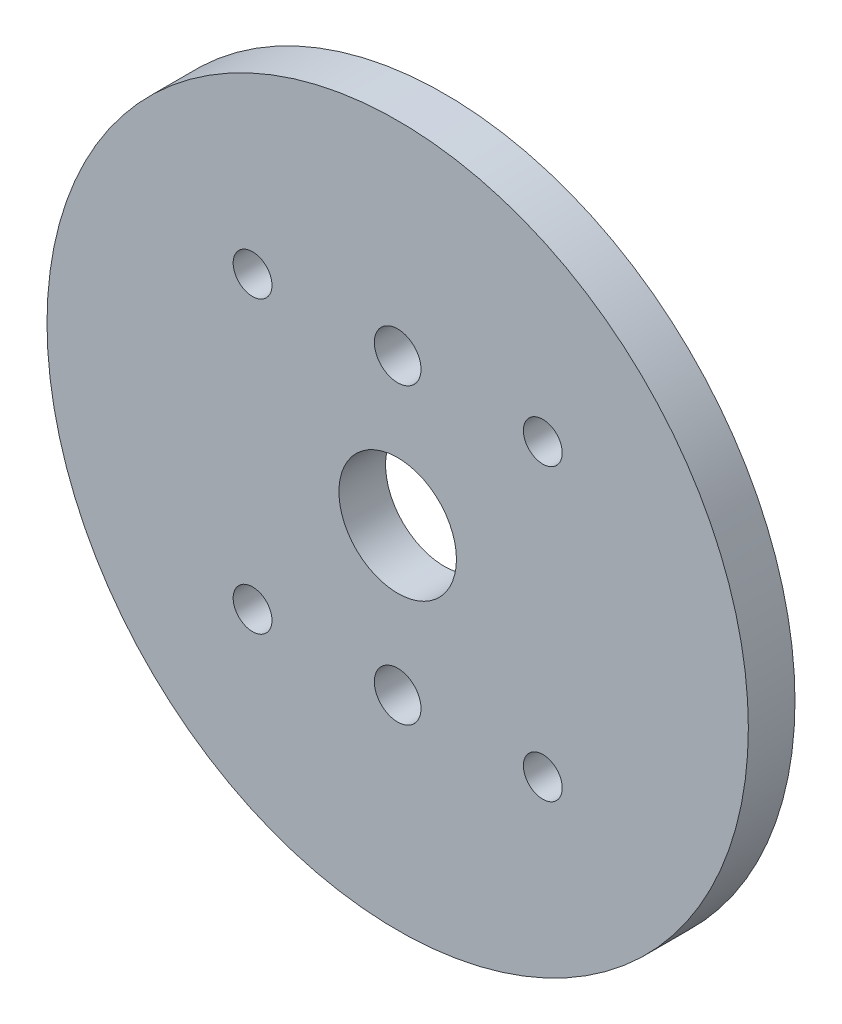
ISO-10303-21;
HEADER;
FILE_DESCRIPTION(('STEP AP214'),'2;1');
FILE_NAME('part.step','',(''),(''),'','','');
FILE_SCHEMA(('AUTOMOTIVE_DESIGN { 1 0 10303 214 1 1 1 1 }'));
ENDSEC;
DATA;
#1=APPLICATION_CONTEXT('core data for automotive mechanical design processes');
#2=APPLICATION_PROTOCOL_DEFINITION('international standard','automotive_design',2000,#1);
#3=PRODUCT_CONTEXT('',#1,'mechanical');
#4=PRODUCT('Part','Part','',(#3));
#5=PRODUCT_RELATED_PRODUCT_CATEGORY('part','',(#4));
#6=PRODUCT_DEFINITION_FORMATION('','',#4);
#7=PRODUCT_DEFINITION_CONTEXT('part definition',#1,'design');
#8=PRODUCT_DEFINITION('design','',#6,#7);
#9=PRODUCT_DEFINITION_SHAPE('','',#8);
#10=(LENGTH_UNIT() NAMED_UNIT(*) SI_UNIT(.MILLI.,.METRE.));
#11=(NAMED_UNIT(*) PLANE_ANGLE_UNIT() SI_UNIT($,.RADIAN.));
#12=(NAMED_UNIT(*) SI_UNIT($,.STERADIAN.) SOLID_ANGLE_UNIT());
#13=UNCERTAINTY_MEASURE_WITH_UNIT(LENGTH_MEASURE(1.E-05),#10,'distance_accuracy_value','');
#14=(GEOMETRIC_REPRESENTATION_CONTEXT(3) GLOBAL_UNCERTAINTY_ASSIGNED_CONTEXT((#13)) GLOBAL_UNIT_ASSIGNED_CONTEXT((#10,
#11,#12)) REPRESENTATION_CONTEXT('',''));
#15=CARTESIAN_POINT('',(0.,0.,0.));
#16=DIRECTION('',(0.,0.,1.));
#17=DIRECTION('',(1.,0.,0.));
#18=AXIS2_PLACEMENT_3D('',#15,#16,#17);
#19=CARTESIAN_POINT('',(0.,0.,3.175));
#20=DIRECTION('',(0.,0.,1.));
#21=DIRECTION('',(1.,0.,0.));
#22=AXIS2_PLACEMENT_3D('',#19,#20,#21);
#23=PLANE('',#22);
#24=CARTESIAN_POINT('',(-9.87828173317578,9.87828173317581,3.175));
#25=DIRECTION('',(0.,0.,1.));
#26=DIRECTION('',(1.,0.,0.));
#27=AXIS2_PLACEMENT_3D('',#24,#25,#26);
#28=CIRCLE('',#27,1.32080000000039);
#29=CARTESIAN_POINT('',(-8.55748173317538,9.87828173317581,3.175));
#30=VERTEX_POINT('',#29);
#31=EDGE_CURVE('E71',#30,#30,#28,.T.);
#32=ORIENTED_EDGE('',*,*,#31,.F.);
#33=EDGE_LOOP('',(#32));
#34=FACE_BOUND('',#33,.T.);
#35=CARTESIAN_POINT('',(9.87828173317605,-9.87828173317609,3.175));
#36=DIRECTION('',(0.,0.,1.));
#37=DIRECTION('',(1.,0.,0.));
#38=AXIS2_PLACEMENT_3D('',#35,#36,#37);
#39=CIRCLE('',#38,1.3208);
#40=CARTESIAN_POINT('',(11.1990817331761,-9.87828173317609,3.175));
#41=VERTEX_POINT('',#40);
#42=EDGE_CURVE('E59',#41,#41,#39,.T.);
#43=ORIENTED_EDGE('',*,*,#42,.F.);
#44=EDGE_LOOP('',(#43));
#45=FACE_BOUND('',#44,.T.);
#46=CARTESIAN_POINT('',(0.,0.,3.175));
#47=DIRECTION('',(0.,0.,1.));
#48=DIRECTION('',(1.,0.,0.));
#49=AXIS2_PLACEMENT_3D('',#46,#47,#48);
#50=CIRCLE('',#49,4.);
#51=CARTESIAN_POINT('',(4.,0.,3.175));
#52=VERTEX_POINT('',#51);
#53=EDGE_CURVE('E47',#52,#52,#50,.T.);
#54=ORIENTED_EDGE('',*,*,#53,.F.);
#55=EDGE_LOOP('',(#54));
#56=FACE_BOUND('',#55,.T.);
#57=CARTESIAN_POINT('',(0.,0.,3.175));
#58=DIRECTION('',(0.,0.,1.));
#59=DIRECTION('',(1.,0.,0.));
#60=AXIS2_PLACEMENT_3D('',#57,#58,#59);
#61=CIRCLE('',#60,23.87);
#62=CARTESIAN_POINT('',(23.87,0.,3.175));
#63=VERTEX_POINT('',#62);
#64=EDGE_CURVE('E10',#63,#63,#61,.T.);
#65=ORIENTED_EDGE('',*,*,#64,.T.);
#66=EDGE_LOOP('',(#65));
#67=FACE_BOUND('',#66,.T.);
#68=CARTESIAN_POINT('',(0.,10.,3.175));
#69=DIRECTION('',(0.,0.,1.));
#70=DIRECTION('',(1.,0.,0.));
#71=AXIS2_PLACEMENT_3D('',#68,#69,#70);
#72=CIRCLE('',#71,1.5875);
#73=CARTESIAN_POINT('',(1.5875,10.,3.175));
#74=VERTEX_POINT('',#73);
#75=EDGE_CURVE('E42',#74,#74,#72,.T.);
#76=ORIENTED_EDGE('',*,*,#75,.F.);
#77=EDGE_LOOP('',(#76));
#78=FACE_BOUND('',#77,.T.);
#79=CARTESIAN_POINT('',(9.87828173317609,9.87828173317578,3.175));
#80=DIRECTION('',(0.,0.,1.));
#81=DIRECTION('',(1.,0.,0.));
#82=AXIS2_PLACEMENT_3D('',#79,#80,#81);
#83=CIRCLE('',#82,1.32080000000006);
#84=CARTESIAN_POINT('',(11.1990817331761,9.87828173317578,3.175));
#85=VERTEX_POINT('',#84);
#86=EDGE_CURVE('E53',#85,#85,#83,.T.);
#87=ORIENTED_EDGE('',*,*,#86,.F.);
#88=EDGE_LOOP('',(#87));
#89=FACE_BOUND('',#88,.T.);
#90=CARTESIAN_POINT('',(-9.87828173317581,-9.87828173317605,3.175));
#91=DIRECTION('',(0.,0.,1.));
#92=DIRECTION('',(1.,0.,0.));
#93=AXIS2_PLACEMENT_3D('',#90,#91,#92);
#94=CIRCLE('',#93,1.32080000000029);
#95=CARTESIAN_POINT('',(-8.55748173317552,-9.87828173317605,3.175));
#96=VERTEX_POINT('',#95);
#97=EDGE_CURVE('E65',#96,#96,#94,.T.);
#98=ORIENTED_EDGE('',*,*,#97,.F.);
#99=EDGE_LOOP('',(#98));
#100=FACE_BOUND('',#99,.T.);
#101=CARTESIAN_POINT('',(2.8176792204172E-13,-10.,3.175));
#102=DIRECTION('',(0.,0.,1.));
#103=DIRECTION('',(1.,0.,0.));
#104=AXIS2_PLACEMENT_3D('',#101,#102,#103);
#105=CIRCLE('',#104,1.5875);
#106=CARTESIAN_POINT('',(1.58750000000028,-10.,3.175));
#107=VERTEX_POINT('',#106);
#108=EDGE_CURVE('E77',#107,#107,#105,.T.);
#109=ORIENTED_EDGE('',*,*,#108,.F.);
#110=EDGE_LOOP('',(#109));
#111=FACE_BOUND('',#110,.T.);
#112=ADVANCED_FACE('F31',(#34,#45,#56,#67,#78,#89,#100,#111),#23,.T.);
#113=CARTESIAN_POINT('',(0.,0.,0.));
#114=DIRECTION('',(0.,0.,1.));
#115=DIRECTION('',(1.,0.,0.));
#116=AXIS2_PLACEMENT_3D('',#113,#114,#115);
#117=PLANE('',#116);
#118=CARTESIAN_POINT('',(-9.87828173317578,9.87828173317581,0.));
#119=DIRECTION('',(0.,0.,1.));
#120=DIRECTION('',(1.,0.,0.));
#121=AXIS2_PLACEMENT_3D('',#118,#119,#120);
#122=CIRCLE('',#121,1.32080000000039);
#123=CARTESIAN_POINT('',(-8.55748173317538,9.87828173317581,0.));
#124=VERTEX_POINT('',#123);
#125=EDGE_CURVE('E74',#124,#124,#122,.T.);
#126=ORIENTED_EDGE('',*,*,#125,.T.);
#127=EDGE_LOOP('',(#126));
#128=FACE_BOUND('',#127,.T.);
#129=CARTESIAN_POINT('',(9.87828173317605,-9.87828173317609,0.));
#130=DIRECTION('',(0.,0.,1.));
#131=DIRECTION('',(1.,0.,0.));
#132=AXIS2_PLACEMENT_3D('',#129,#130,#131);
#133=CIRCLE('',#132,1.3208);
#134=CARTESIAN_POINT('',(11.1990817331761,-9.87828173317609,0.));
#135=VERTEX_POINT('',#134);
#136=EDGE_CURVE('E62',#135,#135,#133,.T.);
#137=ORIENTED_EDGE('',*,*,#136,.T.);
#138=EDGE_LOOP('',(#137));
#139=FACE_BOUND('',#138,.T.);
#140=CARTESIAN_POINT('',(0.,0.,0.));
#141=DIRECTION('',(0.,0.,1.));
#142=DIRECTION('',(1.,0.,0.));
#143=AXIS2_PLACEMENT_3D('',#140,#141,#142);
#144=CIRCLE('',#143,4.);
#145=CARTESIAN_POINT('',(4.,0.,0.));
#146=VERTEX_POINT('',#145);
#147=EDGE_CURVE('E50',#146,#146,#144,.T.);
#148=ORIENTED_EDGE('',*,*,#147,.T.);
#149=EDGE_LOOP('',(#148));
#150=FACE_BOUND('',#149,.T.);
#151=CARTESIAN_POINT('',(0.,0.,0.));
#152=DIRECTION('',(0.,0.,1.));
#153=DIRECTION('',(1.,0.,0.));
#154=AXIS2_PLACEMENT_3D('',#151,#152,#153);
#155=CIRCLE('',#154,23.87);
#156=CARTESIAN_POINT('',(23.87,0.,0.));
#157=VERTEX_POINT('',#156);
#158=EDGE_CURVE('E35',#157,#157,#155,.T.);
#159=ORIENTED_EDGE('',*,*,#158,.F.);
#160=EDGE_LOOP('',(#159));
#161=FACE_BOUND('',#160,.T.);
#162=CARTESIAN_POINT('',(0.,10.,0.));
#163=DIRECTION('',(0.,0.,1.));
#164=DIRECTION('',(1.,0.,0.));
#165=AXIS2_PLACEMENT_3D('',#162,#163,#164);
#166=CIRCLE('',#165,1.5875);
#167=CARTESIAN_POINT('',(1.5875,10.,0.));
#168=VERTEX_POINT('',#167);
#169=EDGE_CURVE('E44',#168,#168,#166,.T.);
#170=ORIENTED_EDGE('',*,*,#169,.T.);
#171=EDGE_LOOP('',(#170));
#172=FACE_BOUND('',#171,.T.);
#173=CARTESIAN_POINT('',(9.87828173317609,9.87828173317578,0.));
#174=DIRECTION('',(0.,0.,1.));
#175=DIRECTION('',(1.,0.,0.));
#176=AXIS2_PLACEMENT_3D('',#173,#174,#175);
#177=CIRCLE('',#176,1.32080000000006);
#178=CARTESIAN_POINT('',(11.1990817331761,9.87828173317578,0.));
#179=VERTEX_POINT('',#178);
#180=EDGE_CURVE('E56',#179,#179,#177,.T.);
#181=ORIENTED_EDGE('',*,*,#180,.T.);
#182=EDGE_LOOP('',(#181));
#183=FACE_BOUND('',#182,.T.);
#184=CARTESIAN_POINT('',(-9.87828173317581,-9.87828173317605,0.));
#185=DIRECTION('',(0.,0.,1.));
#186=DIRECTION('',(1.,0.,0.));
#187=AXIS2_PLACEMENT_3D('',#184,#185,#186);
#188=CIRCLE('',#187,1.32080000000029);
#189=CARTESIAN_POINT('',(-8.55748173317552,-9.87828173317605,0.));
#190=VERTEX_POINT('',#189);
#191=EDGE_CURVE('E68',#190,#190,#188,.T.);
#192=ORIENTED_EDGE('',*,*,#191,.T.);
#193=EDGE_LOOP('',(#192));
#194=FACE_BOUND('',#193,.T.);
#195=CARTESIAN_POINT('',(2.8176792204172E-13,-10.,0.));
#196=DIRECTION('',(0.,0.,1.));
#197=DIRECTION('',(1.,0.,0.));
#198=AXIS2_PLACEMENT_3D('',#195,#196,#197);
#199=CIRCLE('',#198,1.5875);
#200=CARTESIAN_POINT('',(1.58750000000028,-10.,0.));
#201=VERTEX_POINT('',#200);
#202=EDGE_CURVE('E80',#201,#201,#199,.T.);
#203=ORIENTED_EDGE('',*,*,#202,.T.);
#204=EDGE_LOOP('',(#203));
#205=FACE_BOUND('',#204,.T.);
#206=ADVANCED_FACE('F90',(#128,#139,#150,#161,#172,#183,#194,#205),#117,.F.);
#207=CARTESIAN_POINT('',(0.,0.,3.175));
#208=DIRECTION('',(0.,0.,-1.));
#209=DIRECTION('',(-1.,0.,0.));
#210=AXIS2_PLACEMENT_3D('',#207,#208,#209);
#211=CYLINDRICAL_SURFACE('',#210,23.87);
#212=ORIENTED_EDGE('',*,*,#64,.F.);
#213=EDGE_LOOP('',(#212));
#214=FACE_BOUND('',#213,.T.);
#215=ORIENTED_EDGE('',*,*,#158,.T.);
#216=EDGE_LOOP('',(#215));
#217=FACE_BOUND('',#216,.T.);
#218=ADVANCED_FACE('F33',(#214,#217),#211,.T.);
#219=CARTESIAN_POINT('',(0.,10.,3.175));
#220=DIRECTION('',(0.,0.,-1.));
#221=DIRECTION('',(-1.,0.,0.));
#222=AXIS2_PLACEMENT_3D('',#219,#220,#221);
#223=CYLINDRICAL_SURFACE('',#222,1.5875);
#224=ORIENTED_EDGE('',*,*,#75,.T.);
#225=EDGE_LOOP('',(#224));
#226=FACE_BOUND('',#225,.T.);
#227=ORIENTED_EDGE('',*,*,#169,.F.);
#228=EDGE_LOOP('',(#227));
#229=FACE_BOUND('',#228,.T.);
#230=ADVANCED_FACE('F100',(#226,#229),#223,.F.);
#231=CARTESIAN_POINT('',(0.,0.,3.175));
#232=DIRECTION('',(0.,0.,-1.));
#233=DIRECTION('',(-1.,0.,0.));
#234=AXIS2_PLACEMENT_3D('',#231,#232,#233);
#235=CYLINDRICAL_SURFACE('',#234,4.);
#236=ORIENTED_EDGE('',*,*,#53,.T.);
#237=EDGE_LOOP('',(#236));
#238=FACE_BOUND('',#237,.T.);
#239=ORIENTED_EDGE('',*,*,#147,.F.);
#240=EDGE_LOOP('',(#239));
#241=FACE_BOUND('',#240,.T.);
#242=ADVANCED_FACE('F103',(#238,#241),#235,.F.);
#243=CARTESIAN_POINT('',(9.87828173317609,9.87828173317578,3.175));
#244=DIRECTION('',(0.,0.,-1.));
#245=DIRECTION('',(-1.,0.,0.));
#246=AXIS2_PLACEMENT_3D('',#243,#244,#245);
#247=CYLINDRICAL_SURFACE('',#246,1.32080000000006);
#248=ORIENTED_EDGE('',*,*,#86,.T.);
#249=EDGE_LOOP('',(#248));
#250=FACE_BOUND('',#249,.T.);
#251=ORIENTED_EDGE('',*,*,#180,.F.);
#252=EDGE_LOOP('',(#251));
#253=FACE_BOUND('',#252,.T.);
#254=ADVANCED_FACE('F107',(#250,#253),#247,.F.);
#255=CARTESIAN_POINT('',(9.87828173317605,-9.87828173317609,3.175));
#256=DIRECTION('',(0.,0.,-1.));
#257=DIRECTION('',(-1.,0.,0.));
#258=AXIS2_PLACEMENT_3D('',#255,#256,#257);
#259=CYLINDRICAL_SURFACE('',#258,1.3208);
#260=ORIENTED_EDGE('',*,*,#42,.T.);
#261=EDGE_LOOP('',(#260));
#262=FACE_BOUND('',#261,.T.);
#263=ORIENTED_EDGE('',*,*,#136,.F.);
#264=EDGE_LOOP('',(#263));
#265=FACE_BOUND('',#264,.T.);
#266=ADVANCED_FACE('F111',(#262,#265),#259,.F.);
#267=CARTESIAN_POINT('',(-9.87828173317581,-9.87828173317605,3.175));
#268=DIRECTION('',(0.,0.,-1.));
#269=DIRECTION('',(-1.,0.,0.));
#270=AXIS2_PLACEMENT_3D('',#267,#268,#269);
#271=CYLINDRICAL_SURFACE('',#270,1.32080000000029);
#272=ORIENTED_EDGE('',*,*,#97,.T.);
#273=EDGE_LOOP('',(#272));
#274=FACE_BOUND('',#273,.T.);
#275=ORIENTED_EDGE('',*,*,#191,.F.);
#276=EDGE_LOOP('',(#275));
#277=FACE_BOUND('',#276,.T.);
#278=ADVANCED_FACE('F115',(#274,#277),#271,.F.);
#279=CARTESIAN_POINT('',(-9.87828173317578,9.87828173317581,3.175));
#280=DIRECTION('',(0.,0.,-1.));
#281=DIRECTION('',(-1.,0.,0.));
#282=AXIS2_PLACEMENT_3D('',#279,#280,#281);
#283=CYLINDRICAL_SURFACE('',#282,1.32080000000039);
#284=ORIENTED_EDGE('',*,*,#31,.T.);
#285=EDGE_LOOP('',(#284));
#286=FACE_BOUND('',#285,.T.);
#287=ORIENTED_EDGE('',*,*,#125,.F.);
#288=EDGE_LOOP('',(#287));
#289=FACE_BOUND('',#288,.T.);
#290=ADVANCED_FACE('F119',(#286,#289),#283,.F.);
#291=CARTESIAN_POINT('',(2.8176792204172E-13,-10.,3.175));
#292=DIRECTION('',(0.,0.,-1.));
#293=DIRECTION('',(-1.,0.,0.));
#294=AXIS2_PLACEMENT_3D('',#291,#292,#293);
#295=CYLINDRICAL_SURFACE('',#294,1.5875);
#296=ORIENTED_EDGE('',*,*,#108,.T.);
#297=EDGE_LOOP('',(#296));
#298=FACE_BOUND('',#297,.T.);
#299=ORIENTED_EDGE('',*,*,#202,.F.);
#300=EDGE_LOOP('',(#299));
#301=FACE_BOUND('',#300,.T.);
#302=ADVANCED_FACE('F86',(#298,#301),#295,.F.);
#303=CLOSED_SHELL('',(#112,#206,#218,#230,#242,#254,#266,#278,#290,#302));
#304=MANIFOLD_SOLID_BREP('B2',#303);
#305=ADVANCED_BREP_SHAPE_REPRESENTATION('',(#18,#304),#14);
#306=SHAPE_DEFINITION_REPRESENTATION(#9,#305);
ENDSEC;
END-ISO-10303-21;
